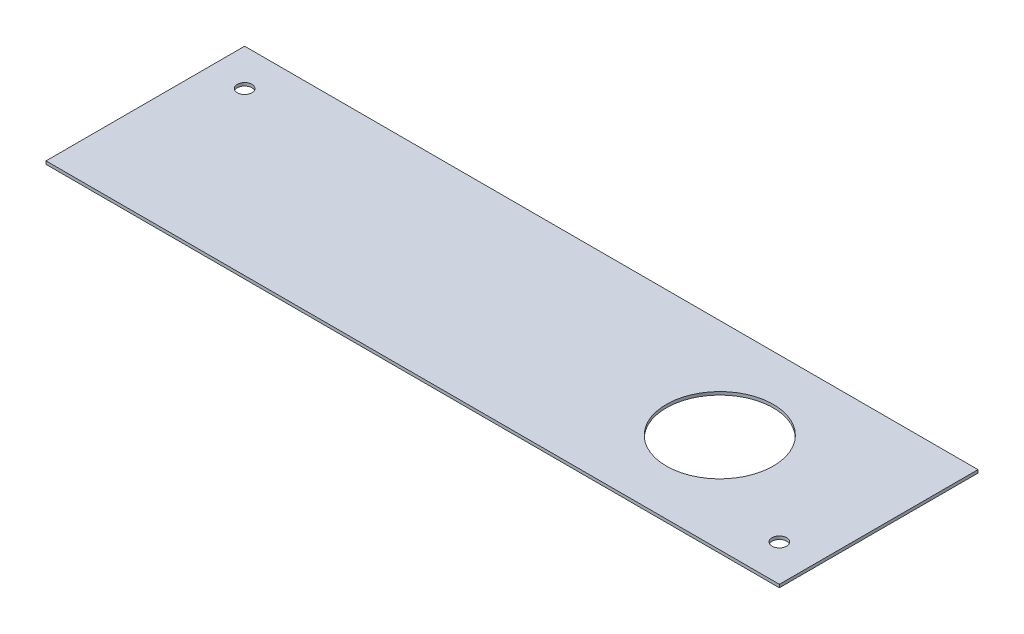
ISO-10303-21;
HEADER;
FILE_DESCRIPTION(('STEP AP214'),'2;1');
FILE_NAME('part.step','',(''),(''),'','','');
FILE_SCHEMA(('AUTOMOTIVE_DESIGN { 1 0 10303 214 1 1 1 1 }'));
ENDSEC;
DATA;
#1=APPLICATION_CONTEXT('core data for automotive mechanical design processes');
#2=APPLICATION_PROTOCOL_DEFINITION('international standard','automotive_design',2000,#1);
#3=PRODUCT_CONTEXT('',#1,'mechanical');
#4=PRODUCT('Part','Part','',(#3));
#5=PRODUCT_RELATED_PRODUCT_CATEGORY('part','',(#4));
#6=PRODUCT_DEFINITION_FORMATION('','',#4);
#7=PRODUCT_DEFINITION_CONTEXT('part definition',#1,'design');
#8=PRODUCT_DEFINITION('design','',#6,#7);
#9=PRODUCT_DEFINITION_SHAPE('','',#8);
#10=(LENGTH_UNIT() NAMED_UNIT(*) SI_UNIT(.MILLI.,.METRE.));
#11=(NAMED_UNIT(*) PLANE_ANGLE_UNIT() SI_UNIT($,.RADIAN.));
#12=(NAMED_UNIT(*) SI_UNIT($,.STERADIAN.) SOLID_ANGLE_UNIT());
#13=UNCERTAINTY_MEASURE_WITH_UNIT(LENGTH_MEASURE(1.E-05),#10,'distance_accuracy_value','');
#14=(GEOMETRIC_REPRESENTATION_CONTEXT(3) GLOBAL_UNCERTAINTY_ASSIGNED_CONTEXT((#13)) GLOBAL_UNIT_ASSIGNED_CONTEXT((#10,
#11,#12)) REPRESENTATION_CONTEXT('',''));
#15=CARTESIAN_POINT('',(0.,0.,0.));
#16=DIRECTION('',(0.,0.,1.));
#17=DIRECTION('',(1.,0.,0.));
#18=AXIS2_PLACEMENT_3D('',#15,#16,#17);
#19=CARTESIAN_POINT('',(-172.116935483871,1.,-24.7681451612903));
#20=DIRECTION('',(1.,0.,0.));
#21=DIRECTION('',(0.,0.,-1.));
#22=AXIS2_PLACEMENT_3D('',#19,#20,#21);
#23=PLANE('',#22);
#24=DIRECTION('',(0.,0.,1.));
#25=VECTOR('',#24,1.);
#26=CARTESIAN_POINT('',(-172.116935483871,0.,-24.7681451612903));
#27=LINE('',#26,#25);
#28=CARTESIAN_POINT('',(-172.116935483871,0.,-24.7681451612903));
#29=VERTEX_POINT('',#28);
#30=CARTESIAN_POINT('',(-172.116935483871,0.,40.2318548387097));
#31=VERTEX_POINT('',#30);
#32=EDGE_CURVE('E97',#29,#31,#27,.T.);
#33=ORIENTED_EDGE('',*,*,#32,.T.);
#34=DIRECTION('',(0.,-1.,0.));
#35=VECTOR('',#34,1.);
#36=CARTESIAN_POINT('',(-172.116935483871,1.,40.2318548387097));
#37=LINE('',#36,#35);
#38=CARTESIAN_POINT('',(-172.116935483871,1.,40.2318548387097));
#39=VERTEX_POINT('',#38);
#40=EDGE_CURVE('E11',#39,#31,#37,.T.);
#41=ORIENTED_EDGE('',*,*,#40,.F.);
#42=DIRECTION('',(0.,0.,1.));
#43=VECTOR('',#42,1.);
#44=CARTESIAN_POINT('',(-172.116935483871,1.,-24.7681451612903));
#45=LINE('',#44,#43);
#46=CARTESIAN_POINT('',(-172.116935483871,1.,-24.7681451612903));
#47=VERTEX_POINT('',#46);
#48=EDGE_CURVE('E84',#47,#39,#45,.T.);
#49=ORIENTED_EDGE('',*,*,#48,.F.);
#50=DIRECTION('',(0.,-1.,0.));
#51=VECTOR('',#50,1.);
#52=CARTESIAN_POINT('',(-172.116935483871,1.,-24.7681451612903));
#53=LINE('',#52,#51);
#54=EDGE_CURVE('E93',#47,#29,#53,.T.);
#55=ORIENTED_EDGE('',*,*,#54,.T.);
#56=EDGE_LOOP('',(#33,#41,#49,#55));
#57=FACE_BOUND('',#56,.T.);
#58=ADVANCED_FACE('F32',(#57),#23,.F.);
#59=CARTESIAN_POINT('',(-172.116935483871,1.,40.2318548387097));
#60=DIRECTION('',(0.,0.,-1.));
#61=DIRECTION('',(-1.,0.,0.));
#62=AXIS2_PLACEMENT_3D('',#59,#60,#61);
#63=PLANE('',#62);
#64=DIRECTION('',(1.,0.,0.));
#65=VECTOR('',#64,1.);
#66=CARTESIAN_POINT('',(-172.116935483871,0.,40.2318548387097));
#67=LINE('',#66,#65);
#68=CARTESIAN_POINT('',(67.8830645161291,0.,40.2318548387097));
#69=VERTEX_POINT('',#68);
#70=EDGE_CURVE('E88',#31,#69,#67,.T.);
#71=ORIENTED_EDGE('',*,*,#70,.T.);
#72=DIRECTION('',(0.,-1.,0.));
#73=VECTOR('',#72,1.);
#74=CARTESIAN_POINT('',(67.8830645161291,1.,40.2318548387097));
#75=LINE('',#74,#73);
#76=CARTESIAN_POINT('',(67.8830645161291,1.,40.2318548387097));
#77=VERTEX_POINT('',#76);
#78=EDGE_CURVE('E41',#77,#69,#75,.T.);
#79=ORIENTED_EDGE('',*,*,#78,.F.);
#80=DIRECTION('',(1.,0.,0.));
#81=VECTOR('',#80,1.);
#82=CARTESIAN_POINT('',(-172.116935483871,1.,40.2318548387097));
#83=LINE('',#82,#81);
#84=EDGE_CURVE('E79',#39,#77,#83,.T.);
#85=ORIENTED_EDGE('',*,*,#84,.F.);
#86=ORIENTED_EDGE('',*,*,#40,.T.);
#87=EDGE_LOOP('',(#71,#79,#85,#86));
#88=FACE_BOUND('',#87,.T.);
#89=ADVANCED_FACE('F87',(#88),#63,.F.);
#90=CARTESIAN_POINT('',(67.8830645161291,1.,-24.7681451612903));
#91=DIRECTION('',(-1.,0.,0.));
#92=DIRECTION('',(0.,0.,1.));
#93=AXIS2_PLACEMENT_3D('',#90,#91,#92);
#94=PLANE('',#93);
#95=DIRECTION('',(0.,0.,-1.));
#96=VECTOR('',#95,1.);
#97=CARTESIAN_POINT('',(67.8830645161291,0.,-24.7681451612903));
#98=LINE('',#97,#96);
#99=CARTESIAN_POINT('',(67.8830645161291,0.,-24.7681451612903));
#100=VERTEX_POINT('',#99);
#101=EDGE_CURVE('E66',#69,#100,#98,.T.);
#102=ORIENTED_EDGE('',*,*,#101,.T.);
#103=DIRECTION('',(0.,-1.,0.));
#104=VECTOR('',#103,1.);
#105=CARTESIAN_POINT('',(67.8830645161291,1.,-24.7681451612903));
#106=LINE('',#105,#104);
#107=CARTESIAN_POINT('',(67.8830645161291,1.,-24.7681451612903));
#108=VERTEX_POINT('',#107);
#109=EDGE_CURVE('E89',#108,#100,#106,.T.);
#110=ORIENTED_EDGE('',*,*,#109,.F.);
#111=DIRECTION('',(0.,0.,-1.));
#112=VECTOR('',#111,1.);
#113=CARTESIAN_POINT('',(67.8830645161291,1.,-24.7681451612903));
#114=LINE('',#113,#112);
#115=EDGE_CURVE('E82',#77,#108,#114,.T.);
#116=ORIENTED_EDGE('',*,*,#115,.F.);
#117=ORIENTED_EDGE('',*,*,#78,.T.);
#118=EDGE_LOOP('',(#102,#110,#116,#117));
#119=FACE_BOUND('',#118,.T.);
#120=ADVANCED_FACE('F91',(#119),#94,.F.);
#121=CARTESIAN_POINT('',(-172.116935483871,1.,-24.7681451612903));
#122=DIRECTION('',(0.,0.,1.));
#123=DIRECTION('',(1.,0.,0.));
#124=AXIS2_PLACEMENT_3D('',#121,#122,#123);
#125=PLANE('',#124);
#126=DIRECTION('',(-1.,0.,0.));
#127=VECTOR('',#126,1.);
#128=CARTESIAN_POINT('',(-172.116935483871,0.,-24.7681451612903));
#129=LINE('',#128,#127);
#130=EDGE_CURVE('E72',#100,#29,#129,.T.);
#131=ORIENTED_EDGE('',*,*,#130,.T.);
#132=ORIENTED_EDGE('',*,*,#54,.F.);
#133=DIRECTION('',(-1.,0.,0.));
#134=VECTOR('',#133,1.);
#135=CARTESIAN_POINT('',(-172.116935483871,1.,-24.7681451612903));
#136=LINE('',#135,#134);
#137=EDGE_CURVE('E49',#108,#47,#136,.T.);
#138=ORIENTED_EDGE('',*,*,#137,.F.);
#139=ORIENTED_EDGE('',*,*,#109,.T.);
#140=EDGE_LOOP('',(#131,#132,#138,#139));
#141=FACE_BOUND('',#140,.T.);
#142=ADVANCED_FACE('F105',(#141),#125,.F.);
#143=CARTESIAN_POINT('',(0.,1.,0.));
#144=DIRECTION('',(0.,1.,0.));
#145=DIRECTION('',(0.,0.,1.));
#146=AXIS2_PLACEMENT_3D('',#143,#144,#145);
#147=PLANE('',#146);
#148=CARTESIAN_POINT('',(15.8830645161291,1.,7.73185483870968));
#149=DIRECTION('',(0.,1.,0.));
#150=DIRECTION('',(0.,0.,1.));
#151=AXIS2_PLACEMENT_3D('',#148,#149,#150);
#152=CIRCLE('',#151,17.5);
#153=CARTESIAN_POINT('',(15.8830645161291,1.,25.2318548387097));
#154=VERTEX_POINT('',#153);
#155=EDGE_CURVE('E122',#154,#154,#152,.T.);
#156=ORIENTED_EDGE('',*,*,#155,.F.);
#157=EDGE_LOOP('',(#156));
#158=FACE_BOUND('',#157,.T.);
#159=CARTESIAN_POINT('',(-160.116935483871,1.,-12.7681451612903));
#160=DIRECTION('',(0.,1.,0.));
#161=DIRECTION('',(0.,0.,1.));
#162=AXIS2_PLACEMENT_3D('',#159,#160,#161);
#163=CIRCLE('',#162,2.39999999999999);
#164=CARTESIAN_POINT('',(-160.116935483871,1.,-10.3681451612903));
#165=VERTEX_POINT('',#164);
#166=EDGE_CURVE('E119',#165,#165,#163,.T.);
#167=ORIENTED_EDGE('',*,*,#166,.F.);
#168=EDGE_LOOP('',(#167));
#169=FACE_BOUND('',#168,.T.);
#170=CARTESIAN_POINT('',(55.8830645161291,1.,28.2318548387097));
#171=DIRECTION('',(0.,1.,0.));
#172=DIRECTION('',(0.,0.,1.));
#173=AXIS2_PLACEMENT_3D('',#170,#171,#172);
#174=CIRCLE('',#173,2.39999999999999);
#175=CARTESIAN_POINT('',(55.8830645161291,1.,30.6318548387097));
#176=VERTEX_POINT('',#175);
#177=EDGE_CURVE('E113',#176,#176,#174,.T.);
#178=ORIENTED_EDGE('',*,*,#177,.F.);
#179=EDGE_LOOP('',(#178));
#180=FACE_BOUND('',#179,.T.);
#181=ORIENTED_EDGE('',*,*,#48,.T.);
#182=ORIENTED_EDGE('',*,*,#84,.T.);
#183=ORIENTED_EDGE('',*,*,#115,.T.);
#184=ORIENTED_EDGE('',*,*,#137,.T.);
#185=EDGE_LOOP('',(#181,#182,#183,#184));
#186=FACE_BOUND('',#185,.T.);
#187=ADVANCED_FACE('F80',(#158,#169,#180,#186),#147,.T.);
#188=CARTESIAN_POINT('',(0.,0.,0.));
#189=DIRECTION('',(0.,1.,0.));
#190=DIRECTION('',(0.,0.,1.));
#191=AXIS2_PLACEMENT_3D('',#188,#189,#190);
#192=PLANE('',#191);
#193=CARTESIAN_POINT('',(15.8830645161291,0.,7.73185483870968));
#194=DIRECTION('',(0.,1.,0.));
#195=DIRECTION('',(0.,0.,1.));
#196=AXIS2_PLACEMENT_3D('',#193,#194,#195);
#197=CIRCLE('',#196,17.5);
#198=CARTESIAN_POINT('',(15.8830645161291,0.,25.2318548387097));
#199=VERTEX_POINT('',#198);
#200=EDGE_CURVE('E35',#199,#199,#197,.T.);
#201=ORIENTED_EDGE('',*,*,#200,.T.);
#202=EDGE_LOOP('',(#201));
#203=FACE_BOUND('',#202,.T.);
#204=CARTESIAN_POINT('',(-160.116935483871,0.,-12.7681451612903));
#205=DIRECTION('',(0.,1.,0.));
#206=DIRECTION('',(0.,0.,1.));
#207=AXIS2_PLACEMENT_3D('',#204,#205,#206);
#208=CIRCLE('',#207,2.39999999999999);
#209=CARTESIAN_POINT('',(-160.116935483871,0.,-10.3681451612903));
#210=VERTEX_POINT('',#209);
#211=EDGE_CURVE('E116',#210,#210,#208,.T.);
#212=ORIENTED_EDGE('',*,*,#211,.T.);
#213=EDGE_LOOP('',(#212));
#214=FACE_BOUND('',#213,.T.);
#215=CARTESIAN_POINT('',(55.8830645161291,0.,28.2318548387097));
#216=DIRECTION('',(0.,1.,0.));
#217=DIRECTION('',(0.,0.,1.));
#218=AXIS2_PLACEMENT_3D('',#215,#216,#217);
#219=CIRCLE('',#218,2.4);
#220=CARTESIAN_POINT('',(55.8830645161291,0.,30.6318548387097));
#221=VERTEX_POINT('',#220);
#222=EDGE_CURVE('E100',#221,#221,#219,.T.);
#223=ORIENTED_EDGE('',*,*,#222,.T.);
#224=EDGE_LOOP('',(#223));
#225=FACE_BOUND('',#224,.T.);
#226=ORIENTED_EDGE('',*,*,#32,.F.);
#227=ORIENTED_EDGE('',*,*,#130,.F.);
#228=ORIENTED_EDGE('',*,*,#101,.F.);
#229=ORIENTED_EDGE('',*,*,#70,.F.);
#230=EDGE_LOOP('',(#226,#227,#228,#229));
#231=FACE_BOUND('',#230,.T.);
#232=ADVANCED_FACE('F108',(#203,#214,#225,#231),#192,.F.);
#233=CARTESIAN_POINT('',(55.8830645161291,1.,28.2318548387097));
#234=DIRECTION('',(0.,1.,0.));
#235=DIRECTION('',(0.,0.,1.));
#236=AXIS2_PLACEMENT_3D('',#233,#234,#235);
#237=CYLINDRICAL_SURFACE('',#236,2.39999999999999);
#238=ORIENTED_EDGE('',*,*,#222,.F.);
#239=EDGE_LOOP('',(#238));
#240=FACE_BOUND('',#239,.T.);
#241=ORIENTED_EDGE('',*,*,#177,.T.);
#242=EDGE_LOOP('',(#241));
#243=FACE_BOUND('',#242,.T.);
#244=ADVANCED_FACE('F138',(#240,#243),#237,.F.);
#245=CARTESIAN_POINT('',(-160.116935483871,1.,-12.7681451612903));
#246=DIRECTION('',(0.,1.,0.));
#247=DIRECTION('',(0.,0.,1.));
#248=AXIS2_PLACEMENT_3D('',#245,#246,#247);
#249=CYLINDRICAL_SURFACE('',#248,2.39999999999999);
#250=ORIENTED_EDGE('',*,*,#211,.F.);
#251=EDGE_LOOP('',(#250));
#252=FACE_BOUND('',#251,.T.);
#253=ORIENTED_EDGE('',*,*,#166,.T.);
#254=EDGE_LOOP('',(#253));
#255=FACE_BOUND('',#254,.T.);
#256=ADVANCED_FACE('F133',(#252,#255),#249,.F.);
#257=CARTESIAN_POINT('',(15.8830645161291,-4.,7.73185483870968));
#258=DIRECTION('',(0.,1.,0.));
#259=DIRECTION('',(0.,0.,1.));
#260=AXIS2_PLACEMENT_3D('',#257,#258,#259);
#261=CYLINDRICAL_SURFACE('',#260,17.5);
#262=ORIENTED_EDGE('',*,*,#155,.T.);
#263=EDGE_LOOP('',(#262));
#264=FACE_BOUND('',#263,.T.);
#265=ORIENTED_EDGE('',*,*,#200,.F.);
#266=EDGE_LOOP('',(#265));
#267=FACE_BOUND('',#266,.T.);
#268=ADVANCED_FACE('F131',(#264,#267),#261,.F.);
#269=CLOSED_SHELL('',(#58,#89,#120,#142,#187,#232,#244,#256,#268));
#270=MANIFOLD_SOLID_BREP('B2',#269);
#271=ADVANCED_BREP_SHAPE_REPRESENTATION('',(#18,#270),#14);
#272=SHAPE_DEFINITION_REPRESENTATION(#9,#271);
ENDSEC;
END-ISO-10303-21;
